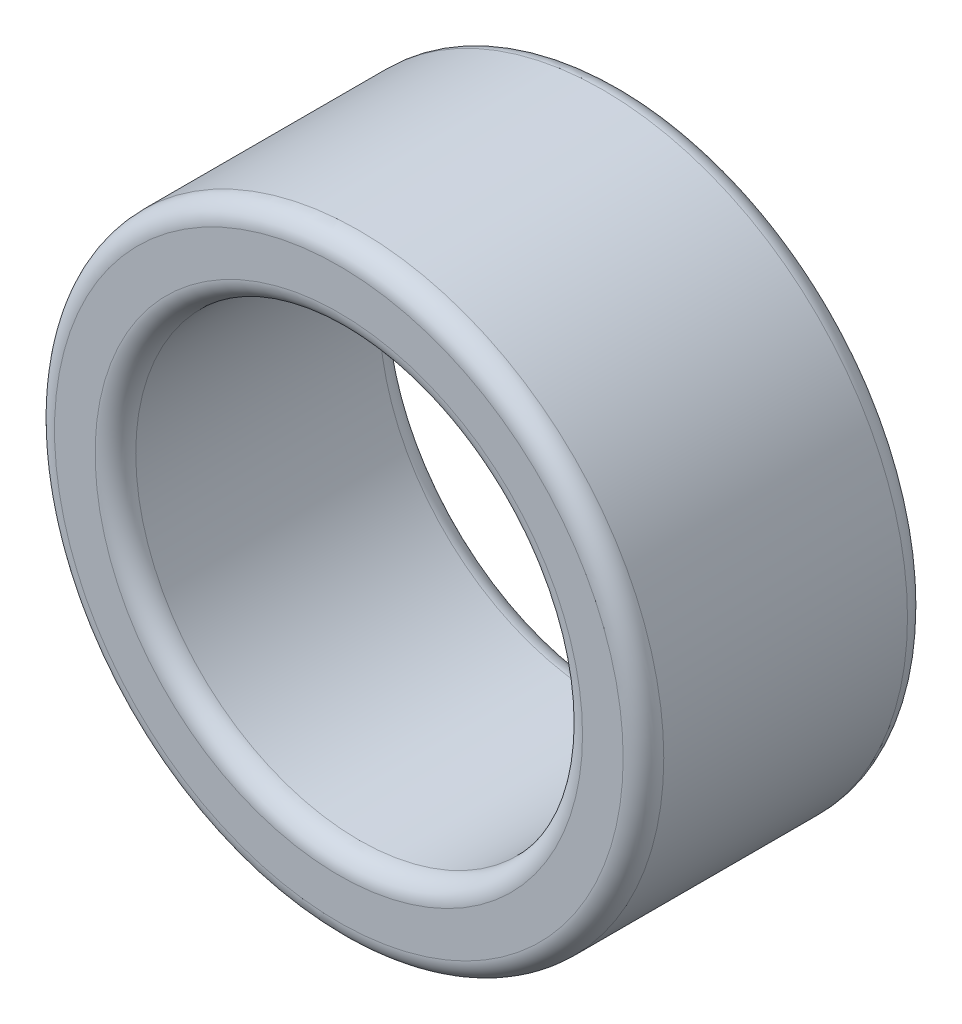
ISO-10303-21;
HEADER;
FILE_DESCRIPTION(('STEP AP214'),'2;1');
FILE_NAME('part.step','',(''),(''),'','','');
FILE_SCHEMA(('AUTOMOTIVE_DESIGN { 1 0 10303 214 1 1 1 1 }'));
ENDSEC;
DATA;
#1=APPLICATION_CONTEXT('core data for automotive mechanical design processes');
#2=APPLICATION_PROTOCOL_DEFINITION('international standard','automotive_design',2000,#1);
#3=PRODUCT_CONTEXT('',#1,'mechanical');
#4=PRODUCT('Part','Part','',(#3));
#5=PRODUCT_RELATED_PRODUCT_CATEGORY('part','',(#4));
#6=PRODUCT_DEFINITION_FORMATION('','',#4);
#7=PRODUCT_DEFINITION_CONTEXT('part definition',#1,'design');
#8=PRODUCT_DEFINITION('design','',#6,#7);
#9=PRODUCT_DEFINITION_SHAPE('','',#8);
#10=(LENGTH_UNIT() NAMED_UNIT(*) SI_UNIT(.MILLI.,.METRE.));
#11=(NAMED_UNIT(*) PLANE_ANGLE_UNIT() SI_UNIT($,.RADIAN.));
#12=(NAMED_UNIT(*) SI_UNIT($,.STERADIAN.) SOLID_ANGLE_UNIT());
#13=UNCERTAINTY_MEASURE_WITH_UNIT(LENGTH_MEASURE(1.E-05),#10,'distance_accuracy_value','');
#14=(GEOMETRIC_REPRESENTATION_CONTEXT(3) GLOBAL_UNCERTAINTY_ASSIGNED_CONTEXT((#13)) GLOBAL_UNIT_ASSIGNED_CONTEXT((#10,
#11,#12)) REPRESENTATION_CONTEXT('',''));
#15=CARTESIAN_POINT('',(0.,0.,0.));
#16=DIRECTION('',(0.,0.,1.));
#17=DIRECTION('',(1.,0.,0.));
#18=AXIS2_PLACEMENT_3D('',#15,#16,#17);
#19=CARTESIAN_POINT('',(0.,0.,204.47));
#20=DIRECTION('',(0.,0.,-1.));
#21=DIRECTION('',(-1.,0.,0.));
#22=AXIS2_PLACEMENT_3D('',#19,#20,#21);
#23=CYLINDRICAL_SURFACE('',#22,57.15);
#24=CARTESIAN_POINT('',(0.,0.,154.94));
#25=DIRECTION('',(0.,0.,1.));
#26=DIRECTION('',(1.,0.,0.));
#27=AXIS2_PLACEMENT_3D('',#24,#25,#26);
#28=CIRCLE('',#27,57.15);
#29=CARTESIAN_POINT('',(57.15,0.,154.94));
#30=VERTEX_POINT('',#29);
#31=EDGE_CURVE('E68',#30,#30,#28,.T.);
#32=ORIENTED_EDGE('',*,*,#31,.T.);
#33=EDGE_LOOP('',(#32));
#34=FACE_BOUND('',#33,.T.);
#35=CARTESIAN_POINT('',(0.,0.,200.66));
#36=DIRECTION('',(0.,0.,1.));
#37=DIRECTION('',(1.,0.,0.));
#38=AXIS2_PLACEMENT_3D('',#35,#36,#37);
#39=CIRCLE('',#38,57.15);
#40=CARTESIAN_POINT('',(57.15,0.,200.66));
#41=VERTEX_POINT('',#40);
#42=EDGE_CURVE('E72',#41,#41,#39,.F.);
#43=ORIENTED_EDGE('',*,*,#42,.T.);
#44=EDGE_LOOP('',(#43));
#45=FACE_BOUND('',#44,.T.);
#46=ADVANCED_FACE('F36',(#34,#45),#23,.T.);
#47=CARTESIAN_POINT('',(0.,0.,204.47));
#48=DIRECTION('',(0.,0.,1.));
#49=DIRECTION('',(1.,0.,0.));
#50=AXIS2_PLACEMENT_3D('',#47,#48,#49);
#51=PLANE('',#50);
#52=CARTESIAN_POINT('',(0.,0.,204.47));
#53=DIRECTION('',(0.,0.,1.));
#54=DIRECTION('',(1.,0.,0.));
#55=AXIS2_PLACEMENT_3D('',#52,#53,#54);
#56=CIRCLE('',#55,45.72);
#57=CARTESIAN_POINT('',(45.72,0.,204.47));
#58=VERTEX_POINT('',#57);
#59=EDGE_CURVE('E10',#58,#58,#56,.F.);
#60=ORIENTED_EDGE('',*,*,#59,.T.);
#61=EDGE_LOOP('',(#60));
#62=FACE_BOUND('',#61,.T.);
#63=CARTESIAN_POINT('',(0.,0.,204.47));
#64=DIRECTION('',(0.,0.,1.));
#65=DIRECTION('',(1.,0.,0.));
#66=AXIS2_PLACEMENT_3D('',#63,#64,#65);
#67=CIRCLE('',#66,53.34);
#68=CARTESIAN_POINT('',(53.34,0.,204.47));
#69=VERTEX_POINT('',#68);
#70=EDGE_CURVE('E60',#69,#69,#67,.T.);
#71=ORIENTED_EDGE('',*,*,#70,.T.);
#72=EDGE_LOOP('',(#71));
#73=FACE_BOUND('',#72,.T.);
#74=ADVANCED_FACE('F86',(#62,#73),#51,.T.);
#75=CARTESIAN_POINT('',(0.,0.,151.13));
#76=DIRECTION('',(0.,0.,1.));
#77=DIRECTION('',(1.,0.,0.));
#78=AXIS2_PLACEMENT_3D('',#75,#76,#77);
#79=PLANE('',#78);
#80=CARTESIAN_POINT('',(0.,0.,151.13));
#81=DIRECTION('',(0.,0.,1.));
#82=DIRECTION('',(1.,0.,0.));
#83=AXIS2_PLACEMENT_3D('',#80,#81,#82);
#84=CIRCLE('',#83,45.72);
#85=CARTESIAN_POINT('',(45.72,0.,151.13));
#86=VERTEX_POINT('',#85);
#87=EDGE_CURVE('E54',#86,#86,#84,.T.);
#88=ORIENTED_EDGE('',*,*,#87,.T.);
#89=EDGE_LOOP('',(#88));
#90=FACE_BOUND('',#89,.T.);
#91=CARTESIAN_POINT('',(0.,0.,151.13));
#92=DIRECTION('',(0.,0.,1.));
#93=DIRECTION('',(1.,0.,0.));
#94=AXIS2_PLACEMENT_3D('',#91,#92,#93);
#95=CIRCLE('',#94,53.34);
#96=CARTESIAN_POINT('',(53.34,0.,151.13));
#97=VERTEX_POINT('',#96);
#98=EDGE_CURVE('E64',#97,#97,#95,.F.);
#99=ORIENTED_EDGE('',*,*,#98,.T.);
#100=EDGE_LOOP('',(#99));
#101=FACE_BOUND('',#100,.T.);
#102=ADVANCED_FACE('F88',(#90,#101),#79,.F.);
#103=CARTESIAN_POINT('',(0.,0.,151.13));
#104=DIRECTION('',(0.,0.,1.));
#105=DIRECTION('',(1.,0.,0.));
#106=AXIS2_PLACEMENT_3D('',#103,#104,#105);
#107=CYLINDRICAL_SURFACE('',#106,41.91);
#108=CARTESIAN_POINT('',(0.,0.,154.94));
#109=DIRECTION('',(0.,0.,1.));
#110=DIRECTION('',(1.,0.,0.));
#111=AXIS2_PLACEMENT_3D('',#108,#109,#110);
#112=CIRCLE('',#111,41.91);
#113=CARTESIAN_POINT('',(41.91,0.,154.94));
#114=VERTEX_POINT('',#113);
#115=EDGE_CURVE('E44',#114,#114,#112,.F.);
#116=ORIENTED_EDGE('',*,*,#115,.T.);
#117=EDGE_LOOP('',(#116));
#118=FACE_BOUND('',#117,.T.);
#119=CARTESIAN_POINT('',(0.,0.,200.66));
#120=DIRECTION('',(0.,0.,1.));
#121=DIRECTION('',(1.,0.,0.));
#122=AXIS2_PLACEMENT_3D('',#119,#120,#121);
#123=CIRCLE('',#122,41.91);
#124=CARTESIAN_POINT('',(41.91,0.,200.66));
#125=VERTEX_POINT('',#124);
#126=EDGE_CURVE('E49',#125,#125,#123,.T.);
#127=ORIENTED_EDGE('',*,*,#126,.T.);
#128=EDGE_LOOP('',(#127));
#129=FACE_BOUND('',#128,.T.);
#130=ADVANCED_FACE('F94',(#118,#129),#107,.F.);
#131=CARTESIAN_POINT('',(0.,0.,154.94));
#132=DIRECTION('',(0.,0.,1.));
#133=DIRECTION('',(1.,0.,0.));
#134=AXIS2_PLACEMENT_3D('',#131,#132,#133);
#135=TOROIDAL_SURFACE('',#134,53.34,3.81);
#136=ORIENTED_EDGE('',*,*,#98,.F.);
#137=EDGE_LOOP('',(#136));
#138=FACE_BOUND('',#137,.T.);
#139=ORIENTED_EDGE('',*,*,#31,.F.);
#140=EDGE_LOOP('',(#139));
#141=FACE_BOUND('',#140,.T.);
#142=ADVANCED_FACE('F82',(#138,#141),#135,.T.);
#143=CARTESIAN_POINT('',(0.,0.,200.66));
#144=DIRECTION('',(0.,0.,1.));
#145=DIRECTION('',(1.,0.,0.));
#146=AXIS2_PLACEMENT_3D('',#143,#144,#145);
#147=TOROIDAL_SURFACE('',#146,53.34,3.81);
#148=ORIENTED_EDGE('',*,*,#42,.F.);
#149=EDGE_LOOP('',(#148));
#150=FACE_BOUND('',#149,.T.);
#151=ORIENTED_EDGE('',*,*,#70,.F.);
#152=EDGE_LOOP('',(#151));
#153=FACE_BOUND('',#152,.T.);
#154=ADVANCED_FACE('F78',(#150,#153),#147,.T.);
#155=CARTESIAN_POINT('',(0.,0.,154.94));
#156=DIRECTION('',(0.,0.,1.));
#157=DIRECTION('',(1.,0.,0.));
#158=AXIS2_PLACEMENT_3D('',#155,#156,#157);
#159=TOROIDAL_SURFACE('',#158,45.72,3.81);
#160=ORIENTED_EDGE('',*,*,#115,.F.);
#161=EDGE_LOOP('',(#160));
#162=FACE_BOUND('',#161,.T.);
#163=ORIENTED_EDGE('',*,*,#87,.F.);
#164=EDGE_LOOP('',(#163));
#165=FACE_BOUND('',#164,.T.);
#166=ADVANCED_FACE('F81',(#162,#165),#159,.T.);
#167=CARTESIAN_POINT('',(0.,0.,200.66));
#168=DIRECTION('',(0.,0.,1.));
#169=DIRECTION('',(1.,0.,0.));
#170=AXIS2_PLACEMENT_3D('',#167,#168,#169);
#171=TOROIDAL_SURFACE('',#170,45.72,3.81);
#172=ORIENTED_EDGE('',*,*,#59,.F.);
#173=EDGE_LOOP('',(#172));
#174=FACE_BOUND('',#173,.T.);
#175=ORIENTED_EDGE('',*,*,#126,.F.);
#176=EDGE_LOOP('',(#175));
#177=FACE_BOUND('',#176,.T.);
#178=ADVANCED_FACE('F38',(#174,#177),#171,.T.);
#179=CLOSED_SHELL('',(#46,#74,#102,#130,#142,#154,#166,#178));
#180=MANIFOLD_SOLID_BREP('B2',#179);
#181=ADVANCED_BREP_SHAPE_REPRESENTATION('',(#18,#180),#14);
#182=SHAPE_DEFINITION_REPRESENTATION(#9,#181);
ENDSEC;
END-ISO-10303-21;
